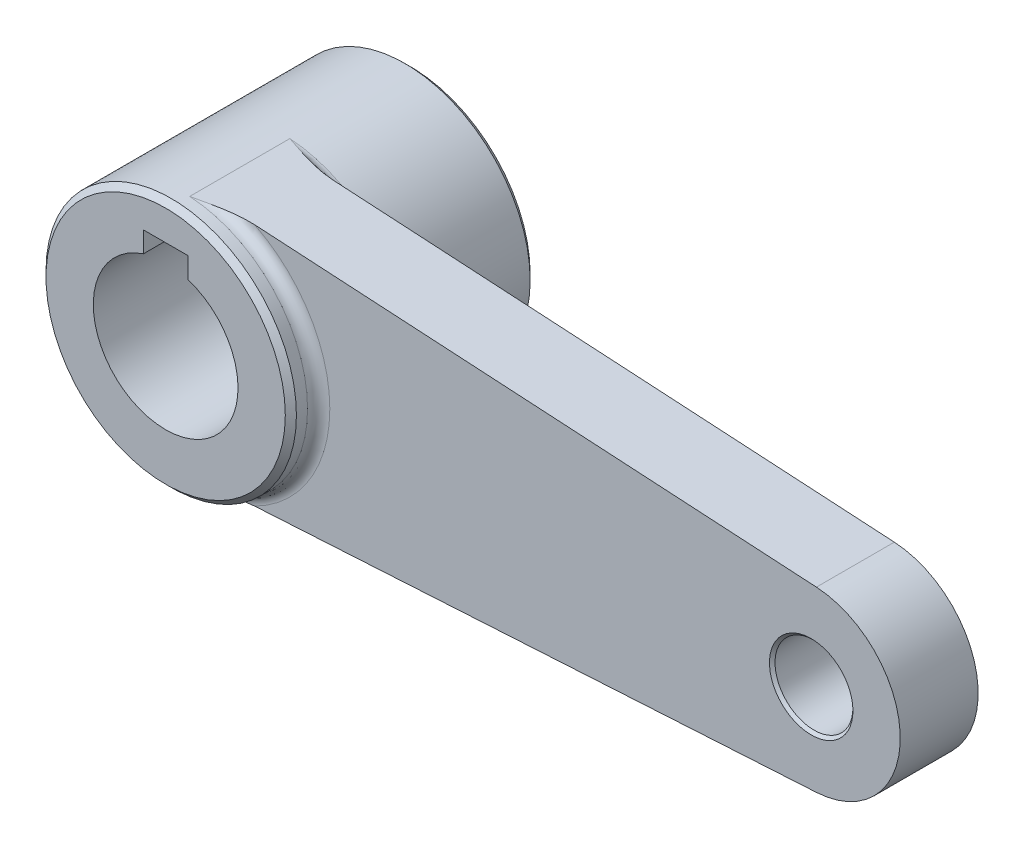
ISO-10303-21;
HEADER;
FILE_DESCRIPTION(('STEP AP214'),'2;1');
FILE_NAME('part.step','',(''),(''),'','','');
FILE_SCHEMA(('AUTOMOTIVE_DESIGN { 1 0 10303 214 1 1 1 1 }'));
ENDSEC;
DATA;
#1=APPLICATION_CONTEXT('core data for automotive mechanical design processes');
#2=APPLICATION_PROTOCOL_DEFINITION('international standard','automotive_design',2000,#1);
#3=PRODUCT_CONTEXT('',#1,'mechanical');
#4=PRODUCT('Part','Part','',(#3));
#5=PRODUCT_RELATED_PRODUCT_CATEGORY('part','',(#4));
#6=PRODUCT_DEFINITION_FORMATION('','',#4);
#7=PRODUCT_DEFINITION_CONTEXT('part definition',#1,'design');
#8=PRODUCT_DEFINITION('design','',#6,#7);
#9=PRODUCT_DEFINITION_SHAPE('','',#8);
#10=(LENGTH_UNIT() NAMED_UNIT(*) SI_UNIT(.MILLI.,.METRE.));
#11=(NAMED_UNIT(*) PLANE_ANGLE_UNIT() SI_UNIT($,.RADIAN.));
#12=(NAMED_UNIT(*) SI_UNIT($,.STERADIAN.) SOLID_ANGLE_UNIT());
#13=UNCERTAINTY_MEASURE_WITH_UNIT(LENGTH_MEASURE(1.E-05),#10,'distance_accuracy_value','');
#14=(GEOMETRIC_REPRESENTATION_CONTEXT(3) GLOBAL_UNCERTAINTY_ASSIGNED_CONTEXT((#13)) GLOBAL_UNIT_ASSIGNED_CONTEXT((#10,
#11,#12)) REPRESENTATION_CONTEXT('',''));
#15=CARTESIAN_POINT('',(0.,0.,0.));
#16=DIRECTION('',(0.,0.,1.));
#17=DIRECTION('',(1.,0.,0.));
#18=AXIS2_PLACEMENT_3D('',#15,#16,#17);
#19=CARTESIAN_POINT('',(0.,0.,7.));
#20=DIRECTION('',(0.,0.,1.));
#21=DIRECTION('',(1.,0.,0.));
#22=AXIS2_PLACEMENT_3D('',#19,#20,#21);
#23=PLANE('',#22);
#24=CARTESIAN_POINT('',(111.,0.,7.));
#25=DIRECTION('',(0.,0.,1.));
#26=DIRECTION('',(1.,0.,0.));
#27=AXIS2_PLACEMENT_3D('',#24,#25,#26);
#28=CIRCLE('',#27,7.50000000000002);
#29=CARTESIAN_POINT('',(118.5,0.,7.));
#30=VERTEX_POINT('',#29);
#31=EDGE_CURVE('E289',#30,#30,#28,.F.);
#32=ORIENTED_EDGE('',*,*,#31,.T.);
#33=EDGE_LOOP('',(#32));
#34=FACE_BOUND('',#33,.T.);
#35=DIRECTION('',(0.998283975239282,-0.0585585585585585,0.));
#36=VECTOR('',#35,1.);
#37=CARTESIAN_POINT('',(1.31756756756757,22.4613894428839,7.));
#38=LINE('',#37,#36);
#39=CARTESIAN_POINT('',(10.9962898050655,21.8936431532765,7.));
#40=VERTEX_POINT('',#39);
#41=CARTESIAN_POINT('',(111.936936936937,15.9725436038285,7.));
#42=VERTEX_POINT('',#41);
#43=EDGE_CURVE('E163',#40,#42,#38,.T.);
#44=ORIENTED_EDGE('',*,*,#43,.F.);
#45=CARTESIAN_POINT('',(0.,0.,7.));
#46=DIRECTION('',(0.,0.,1.));
#47=DIRECTION('',(1.,0.,0.));
#48=AXIS2_PLACEMENT_3D('',#45,#46,#47);
#49=CIRCLE('',#48,24.5);
#50=CARTESIAN_POINT('',(10.9962898050655,-21.8936431532765,7.));
#51=VERTEX_POINT('',#50);
#52=EDGE_CURVE('E189',#40,#51,#49,.F.);
#53=ORIENTED_EDGE('',*,*,#52,.T.);
#54=DIRECTION('',(0.998283975239282,0.0585585585585585,0.));
#55=VECTOR('',#54,1.);
#56=CARTESIAN_POINT('',(1.31756756756757,-22.4613894428838,7.));
#57=LINE('',#56,#55);
#58=CARTESIAN_POINT('',(111.936936936937,-15.9725436038285,7.));
#59=VERTEX_POINT('',#58);
#60=EDGE_CURVE('E157',#51,#59,#57,.T.);
#61=ORIENTED_EDGE('',*,*,#60,.T.);
#62=CARTESIAN_POINT('',(111.,0.,7.));
#63=DIRECTION('',(0.,0.,1.));
#64=DIRECTION('',(1.,0.,0.));
#65=AXIS2_PLACEMENT_3D('',#62,#63,#64);
#66=CIRCLE('',#65,16.);
#67=EDGE_CURVE('E159',#59,#42,#66,.T.);
#68=ORIENTED_EDGE('',*,*,#67,.T.);
#69=EDGE_LOOP('',(#44,#53,#61,#68));
#70=FACE_BOUND('',#69,.T.);
#71=ADVANCED_FACE('F43',(#34,#70),#23,.T.);
#72=CARTESIAN_POINT('',(1.31756756756757,-22.4613894428838,7.));
#73=DIRECTION('',(-0.0585585585585585,0.998283975239282,0.));
#74=DIRECTION('',(-0.998283975239282,-0.0585585585585585,0.));
#75=AXIS2_PLACEMENT_3D('',#72,#73,#74);
#76=PLANE('',#75);
#77=DIRECTION('',(0.,0.,-1.));
#78=VECTOR('',#77,1.);
#79=CARTESIAN_POINT('',(1.31756756756757,-22.4613894428838,7.));
#80=LINE('',#79,#78);
#81=CARTESIAN_POINT('',(1.31756756756757,-22.4613894428839,9.));
#82=VERTEX_POINT('',#81);
#83=CARTESIAN_POINT('',(1.31756756756757,-22.4613894428838,-9.));
#84=VERTEX_POINT('',#83);
#85=EDGE_CURVE('E165',#82,#84,#80,.T.);
#86=ORIENTED_EDGE('',*,*,#85,.T.);
#87=CARTESIAN_POINT('',(10.9962898050655,-21.8936431532765,-7.));
#88=CARTESIAN_POINT('',(10.8278260788221,-21.9035251039267,-7.00002297497926));
#89=CARTESIAN_POINT('',(10.6593905952336,-21.9134053978849,-7.00334376796952));
#90=CARTESIAN_POINT('',(10.3227835789247,-21.9331505026493,-7.01587571187002));
#91=CARTESIAN_POINT('',(10.1546119832606,-21.9430153171478,-7.02508513425725));
#92=CARTESIAN_POINT('',(9.81886810997924,-21.9627097906162,-7.04867395364367));
#93=CARTESIAN_POINT('',(9.65129532963581,-21.9725394790755,-7.06304634939414));
#94=CARTESIAN_POINT('',(9.3165993243305,-21.9921724854265,-7.09639823635647));
#95=CARTESIAN_POINT('',(9.14947613783602,-22.0019758010617,-7.11537810985719));
#96=CARTESIAN_POINT('',(8.65061536144219,-22.0312385847101,-7.17824174159337));
#97=CARTESIAN_POINT('',(8.31963232248668,-22.050653791354,-7.22818385909352));
#98=CARTESIAN_POINT('',(7.65979354367717,-22.0893594189374,-7.34101491840041));
#99=CARTESIAN_POINT('',(7.33093872920629,-22.1086497855947,-7.40390914683806));
#100=CARTESIAN_POINT('',(6.52543402970051,-22.1559000623548,-7.57109840657266));
#101=CARTESIAN_POINT('',(6.049986888175,-22.1837894204623,-7.68117145551755));
#102=CARTESIAN_POINT('',(5.1029363907507,-22.2393426632138,-7.91646706032457));
#103=CARTESIAN_POINT('',(4.63133298341508,-22.2670065508749,-8.04168941310228));
#104=CARTESIAN_POINT('',(3.21916821524031,-22.3498430336018,-8.43212254196753));
#105=CARTESIAN_POINT('',(2.28265199171335,-22.4047783440711,-8.71177325811096));
#106=CARTESIAN_POINT('',(1.33670096668163,-22.4602670926306,-8.99428573376028));
#107=CARTESIAN_POINT('',(1.32713426304262,-22.4608282679967,-8.99714287689267));
#108=CARTESIAN_POINT('',(1.31756756756757,-22.4613894428838,-9.));
#109=B_SPLINE_CURVE_WITH_KNOTS('',3,(#87,#88,#89,#90,#91,#92,#93,#94,#95,#96,#97,#98,#99,#100,
#101,#102,#103,#104,#105,#106,#107,#108),.UNSPECIFIED.,.F.,.F.,(4,2,2,2,2,2,2,2,2,2,4),(0.,
0.506187128911076,1.01222574199209,1.51758071600167,2.02297763435949,3.02849059548933,
4.03441479070745,5.500467955493,6.96650146923954,9.90288267811345,9.93288267811341),.UNSPECIFIED.);
#110=CARTESIAN_POINT('',(10.9962898050655,-21.8936431532765,-7.));
#111=VERTEX_POINT('',#110);
#112=EDGE_CURVE('E201',#84,#111,#109,.F.);
#113=ORIENTED_EDGE('',*,*,#112,.T.);
#114=DIRECTION('',(0.998283975239282,0.0585585585585585,0.));
#115=VECTOR('',#114,1.);
#116=CARTESIAN_POINT('',(1.31756756756757,-22.4613894428838,-7.));
#117=LINE('',#116,#115);
#118=CARTESIAN_POINT('',(111.936936936937,-15.9725436038285,-7.));
#119=VERTEX_POINT('',#118);
#120=EDGE_CURVE('E153',#111,#119,#117,.T.);
#121=ORIENTED_EDGE('',*,*,#120,.T.);
#122=DIRECTION('',(0.,0.,-1.));
#123=VECTOR('',#122,1.);
#124=CARTESIAN_POINT('',(111.936936936937,-15.9725436038285,7.));
#125=LINE('',#124,#123);
#126=EDGE_CURVE('E177',#59,#119,#125,.T.);
#127=ORIENTED_EDGE('',*,*,#126,.F.);
#128=ORIENTED_EDGE('',*,*,#60,.F.);
#129=CARTESIAN_POINT('',(10.9962898050655,-21.8936431532765,7.));
#130=CARTESIAN_POINT('',(10.8278260788221,-21.9035251039267,7.00002297497926));
#131=CARTESIAN_POINT('',(10.6593905952336,-21.9134053978849,7.00334376796952));
#132=CARTESIAN_POINT('',(10.3227835789247,-21.9331505026493,7.01587571187002));
#133=CARTESIAN_POINT('',(10.1546119832606,-21.9430153171478,7.02508513425725));
#134=CARTESIAN_POINT('',(9.81886810997924,-21.9627097906162,7.04867395364367));
#135=CARTESIAN_POINT('',(9.65129532963581,-21.9725394790755,7.06304634939414));
#136=CARTESIAN_POINT('',(9.3165993243305,-21.9921724854265,7.09639823635647));
#137=CARTESIAN_POINT('',(9.14947613783602,-22.0019758010617,7.11537810985719));
#138=CARTESIAN_POINT('',(8.65061536144219,-22.0312385847101,7.17824174159337));
#139=CARTESIAN_POINT('',(8.31963232248668,-22.050653791354,7.22818385909352));
#140=CARTESIAN_POINT('',(7.65979354367717,-22.0893594189374,7.34101491840041));
#141=CARTESIAN_POINT('',(7.33093872920629,-22.1086497855947,7.40390914683806));
#142=CARTESIAN_POINT('',(6.52543402970051,-22.1559000623548,7.57109840657266));
#143=CARTESIAN_POINT('',(6.049986888175,-22.1837894204623,7.68117145551755));
#144=CARTESIAN_POINT('',(5.1029363907507,-22.2393426632138,7.91646706032457));
#145=CARTESIAN_POINT('',(4.63133298341508,-22.2670065508749,8.04168941310228));
#146=CARTESIAN_POINT('',(3.21916821524031,-22.3498430336018,8.43212254196753));
#147=CARTESIAN_POINT('',(2.28265199171335,-22.4047783440711,8.71177325811096));
#148=CARTESIAN_POINT('',(1.33670096668163,-22.4602670926306,8.99428573376028));
#149=CARTESIAN_POINT('',(1.32713426304262,-22.4608282679967,8.99714287689267));
#150=CARTESIAN_POINT('',(1.31756756756757,-22.4613894428838,9.));
#151=B_SPLINE_CURVE_WITH_KNOTS('',3,(#129,#130,#131,#132,#133,#134,#135,#136,#137,#138,#139,
#140,#141,#142,#143,#144,#145,#146,#147,#148,#149,#150),.UNSPECIFIED.,.F.,.F.,(4,2,2,2,2,2,2,2,
2,2,4),(0.,0.506187128911076,1.01222574199209,1.51758071600167,2.02297763435949,
3.02849059548933,4.03441479070745,5.500467955493,6.96650146923954,9.90288267811345,
9.93288267811341),.UNSPECIFIED.);
#152=EDGE_CURVE('E229',#51,#82,#151,.T.);
#153=ORIENTED_EDGE('',*,*,#152,.T.);
#154=EDGE_LOOP('',(#86,#113,#121,#127,#128,#153));
#155=FACE_BOUND('',#154,.T.);
#156=ADVANCED_FACE('F258',(#155),#76,.F.);
#157=CARTESIAN_POINT('',(111.,0.,7.));
#158=DIRECTION('',(0.,0.,-1.));
#159=DIRECTION('',(-1.,0.,0.));
#160=AXIS2_PLACEMENT_3D('',#157,#158,#159);
#161=CYLINDRICAL_SURFACE('',#160,16.);
#162=CARTESIAN_POINT('',(111.,0.,-7.));
#163=DIRECTION('',(0.,0.,1.));
#164=DIRECTION('',(1.,0.,0.));
#165=AXIS2_PLACEMENT_3D('',#162,#163,#164);
#166=CIRCLE('',#165,16.);
#167=CARTESIAN_POINT('',(111.936936936937,15.9725436038285,-7.));
#168=VERTEX_POINT('',#167);
#169=EDGE_CURVE('E167',#119,#168,#166,.T.);
#170=ORIENTED_EDGE('',*,*,#169,.T.);
#171=DIRECTION('',(0.,0.,-1.));
#172=VECTOR('',#171,1.);
#173=CARTESIAN_POINT('',(111.936936936937,15.9725436038285,7.));
#174=LINE('',#173,#172);
#175=EDGE_CURVE('E174',#42,#168,#174,.T.);
#176=ORIENTED_EDGE('',*,*,#175,.F.);
#177=ORIENTED_EDGE('',*,*,#67,.F.);
#178=ORIENTED_EDGE('',*,*,#126,.T.);
#179=EDGE_LOOP('',(#170,#176,#177,#178));
#180=FACE_BOUND('',#179,.T.);
#181=ADVANCED_FACE('F217',(#180),#161,.T.);
#182=CARTESIAN_POINT('',(1.31756756756757,22.4613894428839,7.));
#183=DIRECTION('',(0.0585585585585585,0.998283975239282,0.));
#184=DIRECTION('',(-0.998283975239282,0.0585585585585585,0.));
#185=AXIS2_PLACEMENT_3D('',#182,#183,#184);
#186=PLANE('',#185);
#187=DIRECTION('',(0.998283975239282,-0.0585585585585585,0.));
#188=VECTOR('',#187,1.);
#189=CARTESIAN_POINT('',(1.31756756756757,22.4613894428839,-7.));
#190=LINE('',#189,#188);
#191=CARTESIAN_POINT('',(10.9962898050655,21.8936431532765,-7.));
#192=VERTEX_POINT('',#191);
#193=EDGE_CURVE('E160',#192,#168,#190,.T.);
#194=ORIENTED_EDGE('',*,*,#193,.F.);
#195=CARTESIAN_POINT('',(10.9962898050655,21.8936431532765,-7.));
#196=CARTESIAN_POINT('',(10.8278260788227,21.9035251039267,-7.00002297497926));
#197=CARTESIAN_POINT('',(10.6593905952347,21.9134053978848,-7.0033437679695));
#198=CARTESIAN_POINT('',(10.3227835789271,21.9331505026492,-7.01587571186991));
#199=CARTESIAN_POINT('',(10.1546119832635,21.9430153171477,-7.02508513425707));
#200=CARTESIAN_POINT('',(9.81886810998328,21.9627097906159,-7.04867395364335));
#201=CARTESIAN_POINT('',(9.65129532964032,21.9725394790753,-7.06304634939374));
#202=CARTESIAN_POINT('',(9.31659932433594,21.9921724854262,-7.09639823635588));
#203=CARTESIAN_POINT('',(9.14947613784192,22.0019758010614,-7.11537810985651));
#204=CARTESIAN_POINT('',(8.65061536144741,22.0312385847098,-7.17824174159259));
#205=CARTESIAN_POINT('',(8.31963232249074,22.0506537913537,-7.2281838590928));
#206=CARTESIAN_POINT('',(7.65979354367914,22.0893594189373,-7.34101491840009));
#207=CARTESIAN_POINT('',(7.33093872920733,22.1086497855946,-7.4039091468381));
#208=CARTESIAN_POINT('',(6.52543402970025,22.1559000623548,-7.57109840657233));
#209=CARTESIAN_POINT('',(6.04998688817421,22.1837894204624,-7.68117145551597));
#210=CARTESIAN_POINT('',(5.10293639075034,22.2393426632138,-7.91646706032641));
#211=CARTESIAN_POINT('',(4.63133298341568,22.2670065508748,-8.04168941310881));
#212=CARTESIAN_POINT('',(3.21916821523554,22.3498430336021,-8.43212254195542));
#213=CARTESIAN_POINT('',(2.2826519916926,22.4047783440725,-8.71177325804306));
#214=CARTESIAN_POINT('',(1.33670096668126,22.4602670926306,-8.99428573375888));
#215=CARTESIAN_POINT('',(1.32713426304243,22.4608282679967,-8.99714287689197));
#216=CARTESIAN_POINT('',(1.31756756756756,22.4613894428839,-9.));
#217=B_SPLINE_CURVE_WITH_KNOTS('',3,(#195,#196,#197,#198,#199,#200,#201,#202,#203,#204,#205,
#206,#207,#208,#209,#210,#211,#212,#213,#214,#215,#216),.UNSPECIFIED.,.F.,.F.,(4,2,2,2,2,2,2,2,
2,2,4),(0.,0.506187128909278,1.01222574198848,1.51758071599665,2.02297763435306,
3.02849059548632,4.03441479070745,5.50046795549343,6.96650146924122,9.90288267811339,
9.93288267811341),.UNSPECIFIED.);
#218=CARTESIAN_POINT('',(1.31756756756757,22.4613894428839,-9.));
#219=VERTEX_POINT('',#218);
#220=EDGE_CURVE('E192',#192,#219,#217,.T.);
#221=ORIENTED_EDGE('',*,*,#220,.T.);
#222=DIRECTION('',(0.,0.,-1.));
#223=VECTOR('',#222,1.);
#224=CARTESIAN_POINT('',(1.31756756756757,22.4613894428839,7.));
#225=LINE('',#224,#223);
#226=CARTESIAN_POINT('',(1.31756756756757,22.4613894428839,9.));
#227=VERTEX_POINT('',#226);
#228=EDGE_CURVE('E172',#227,#219,#225,.T.);
#229=ORIENTED_EDGE('',*,*,#228,.F.);
#230=CARTESIAN_POINT('',(10.9962898050655,21.8936431532765,7.));
#231=CARTESIAN_POINT('',(10.8278260788227,21.9035251039267,7.00002297497926));
#232=CARTESIAN_POINT('',(10.6593905952347,21.9134053978848,7.0033437679695));
#233=CARTESIAN_POINT('',(10.3227835789271,21.9331505026492,7.01587571186991));
#234=CARTESIAN_POINT('',(10.1546119832635,21.9430153171477,7.02508513425707));
#235=CARTESIAN_POINT('',(9.81886810998328,21.9627097906159,7.04867395364335));
#236=CARTESIAN_POINT('',(9.65129532964032,21.9725394790753,7.06304634939374));
#237=CARTESIAN_POINT('',(9.31659932433594,21.9921724854262,7.09639823635588));
#238=CARTESIAN_POINT('',(9.14947613784192,22.0019758010614,7.11537810985651));
#239=CARTESIAN_POINT('',(8.65061536144741,22.0312385847098,7.17824174159259));
#240=CARTESIAN_POINT('',(8.31963232249074,22.0506537913537,7.2281838590928));
#241=CARTESIAN_POINT('',(7.65979354367914,22.0893594189373,7.34101491840009));
#242=CARTESIAN_POINT('',(7.33093872920733,22.1086497855946,7.4039091468381));
#243=CARTESIAN_POINT('',(6.52543402970025,22.1559000623548,7.57109840657233));
#244=CARTESIAN_POINT('',(6.04998688817421,22.1837894204624,7.68117145551597));
#245=CARTESIAN_POINT('',(5.10293639075034,22.2393426632138,7.91646706032641));
#246=CARTESIAN_POINT('',(4.63133298341568,22.2670065508748,8.04168941310881));
#247=CARTESIAN_POINT('',(3.21916821523554,22.3498430336021,8.43212254195542));
#248=CARTESIAN_POINT('',(2.2826519916926,22.4047783440725,8.71177325804306));
#249=CARTESIAN_POINT('',(1.33670096668126,22.4602670926306,8.99428573375888));
#250=CARTESIAN_POINT('',(1.32713426304243,22.4608282679967,8.99714287689197));
#251=CARTESIAN_POINT('',(1.31756756756756,22.4613894428839,9.));
#252=B_SPLINE_CURVE_WITH_KNOTS('',3,(#230,#231,#232,#233,#234,#235,#236,#237,#238,#239,#240,
#241,#242,#243,#244,#245,#246,#247,#248,#249,#250,#251),.UNSPECIFIED.,.F.,.F.,(4,2,2,2,2,2,2,2,
2,2,4),(0.,0.506187128909278,1.01222574198848,1.51758071599665,2.02297763435306,
3.02849059548632,4.03441479070745,5.50046795549343,6.96650146924122,9.90288267811339,
9.93288267811341),.UNSPECIFIED.);
#253=EDGE_CURVE('E222',#227,#40,#252,.F.);
#254=ORIENTED_EDGE('',*,*,#253,.T.);
#255=ORIENTED_EDGE('',*,*,#43,.T.);
#256=ORIENTED_EDGE('',*,*,#175,.T.);
#257=EDGE_LOOP('',(#194,#221,#229,#254,#255,#256));
#258=FACE_BOUND('',#257,.T.);
#259=ADVANCED_FACE('F211',(#258),#186,.T.);
#260=CARTESIAN_POINT('',(0.,0.,7.));
#261=DIRECTION('',(0.,0.,-1.));
#262=DIRECTION('',(-1.,0.,0.));
#263=AXIS2_PLACEMENT_3D('',#260,#261,#262);
#264=CYLINDRICAL_SURFACE('',#263,22.5);
#265=CARTESIAN_POINT('',(0.,0.,-31.));
#266=DIRECTION('',(0.,0.,1.));
#267=DIRECTION('',(1.,0.,0.));
#268=AXIS2_PLACEMENT_3D('',#265,#266,#267);
#269=CIRCLE('',#268,22.5);
#270=CARTESIAN_POINT('',(22.5,0.,-31.));
#271=VERTEX_POINT('',#270);
#272=EDGE_CURVE('E51',#271,#271,#269,.T.);
#273=ORIENTED_EDGE('',*,*,#272,.T.);
#274=EDGE_LOOP('',(#273));
#275=FACE_BOUND('',#274,.T.);
#276=CARTESIAN_POINT('',(0.,0.,11.));
#277=DIRECTION('',(0.,0.,1.));
#278=DIRECTION('',(1.,0.,0.));
#279=AXIS2_PLACEMENT_3D('',#276,#277,#278);
#280=CIRCLE('',#279,22.5);
#281=CARTESIAN_POINT('',(22.5,0.,11.));
#282=VERTEX_POINT('',#281);
#283=EDGE_CURVE('E297',#282,#282,#280,.F.);
#284=ORIENTED_EDGE('',*,*,#283,.T.);
#285=EDGE_LOOP('',(#284));
#286=FACE_BOUND('',#285,.T.);
#287=ORIENTED_EDGE('',*,*,#228,.T.);
#288=CARTESIAN_POINT('',(0.,0.,-9.));
#289=DIRECTION('',(0.,0.,1.));
#290=DIRECTION('',(1.,0.,0.));
#291=AXIS2_PLACEMENT_3D('',#288,#289,#290);
#292=CIRCLE('',#291,22.5);
#293=EDGE_CURVE('E186',#219,#84,#292,.F.);
#294=ORIENTED_EDGE('',*,*,#293,.T.);
#295=ORIENTED_EDGE('',*,*,#85,.F.);
#296=CARTESIAN_POINT('',(0.,0.,9.));
#297=DIRECTION('',(0.,0.,1.));
#298=DIRECTION('',(1.,0.,0.));
#299=AXIS2_PLACEMENT_3D('',#296,#297,#298);
#300=CIRCLE('',#299,22.5);
#301=EDGE_CURVE('E183',#82,#227,#300,.T.);
#302=ORIENTED_EDGE('',*,*,#301,.T.);
#303=EDGE_LOOP('',(#287,#294,#295,#302));
#304=FACE_BOUND('',#303,.T.);
#305=ADVANCED_FACE('F216',(#275,#286,#304),#264,.T.);
#306=CARTESIAN_POINT('',(111.,0.,7.));
#307=DIRECTION('',(0.,0.,-1.));
#308=DIRECTION('',(-1.,0.,0.));
#309=AXIS2_PLACEMENT_3D('',#306,#307,#308);
#310=CYLINDRICAL_SURFACE('',#309,7.);
#311=CARTESIAN_POINT('',(111.,0.,-6.49999999999997));
#312=DIRECTION('',(0.,0.,1.));
#313=DIRECTION('',(1.,0.,0.));
#314=AXIS2_PLACEMENT_3D('',#311,#312,#313);
#315=CIRCLE('',#314,7.);
#316=CARTESIAN_POINT('',(118.,0.,-6.49999999999997));
#317=VERTEX_POINT('',#316);
#318=EDGE_CURVE('E284',#317,#317,#315,.F.);
#319=ORIENTED_EDGE('',*,*,#318,.T.);
#320=EDGE_LOOP('',(#319));
#321=FACE_BOUND('',#320,.T.);
#322=CARTESIAN_POINT('',(111.,0.,6.49999999999997));
#323=DIRECTION('',(0.,0.,1.));
#324=DIRECTION('',(1.,0.,0.));
#325=AXIS2_PLACEMENT_3D('',#322,#323,#324);
#326=CIRCLE('',#325,7.);
#327=CARTESIAN_POINT('',(118.,0.,6.49999999999997));
#328=VERTEX_POINT('',#327);
#329=EDGE_CURVE('E287',#328,#328,#326,.T.);
#330=ORIENTED_EDGE('',*,*,#329,.T.);
#331=EDGE_LOOP('',(#330));
#332=FACE_BOUND('',#331,.T.);
#333=ADVANCED_FACE('F273',(#321,#332),#310,.F.);
#334=CARTESIAN_POINT('',(0.,0.,-7.));
#335=DIRECTION('',(0.,0.,1.));
#336=DIRECTION('',(1.,0.,0.));
#337=AXIS2_PLACEMENT_3D('',#334,#335,#336);
#338=PLANE('',#337);
#339=CARTESIAN_POINT('',(111.,0.,-7.));
#340=DIRECTION('',(0.,0.,1.));
#341=DIRECTION('',(1.,0.,0.));
#342=AXIS2_PLACEMENT_3D('',#339,#340,#341);
#343=CIRCLE('',#342,7.50000000000002);
#344=CARTESIAN_POINT('',(118.5,0.,-7.));
#345=VERTEX_POINT('',#344);
#346=EDGE_CURVE('E228',#345,#345,#343,.T.);
#347=ORIENTED_EDGE('',*,*,#346,.T.);
#348=EDGE_LOOP('',(#347));
#349=FACE_BOUND('',#348,.T.);
#350=ORIENTED_EDGE('',*,*,#120,.F.);
#351=CARTESIAN_POINT('',(0.,0.,-7.));
#352=DIRECTION('',(0.,0.,1.));
#353=DIRECTION('',(1.,0.,0.));
#354=AXIS2_PLACEMENT_3D('',#351,#352,#353);
#355=CIRCLE('',#354,24.5);
#356=EDGE_CURVE('E180',#111,#192,#355,.T.);
#357=ORIENTED_EDGE('',*,*,#356,.T.);
#358=ORIENTED_EDGE('',*,*,#193,.T.);
#359=ORIENTED_EDGE('',*,*,#169,.F.);
#360=EDGE_LOOP('',(#350,#357,#358,#359));
#361=FACE_BOUND('',#360,.T.);
#362=ADVANCED_FACE('F271',(#349,#361),#338,.F.);
#363=CARTESIAN_POINT('',(0.,0.,12.));
#364=DIRECTION('',(0.,0.,1.));
#365=DIRECTION('',(1.,0.,0.));
#366=AXIS2_PLACEMENT_3D('',#363,#364,#365);
#367=PLANE('',#366);
#368=CARTESIAN_POINT('',(0.,0.,12.));
#369=DIRECTION('',(0.,0.,1.));
#370=DIRECTION('',(1.,0.,0.));
#371=AXIS2_PLACEMENT_3D('',#368,#369,#370);
#372=CIRCLE('',#371,13.);
#373=CARTESIAN_POINT('',(-4.00000000000001,12.369316876853,12.));
#374=VERTEX_POINT('',#373);
#375=CARTESIAN_POINT('',(4.,12.369316876853,12.));
#376=VERTEX_POINT('',#375);
#377=EDGE_CURVE('E58',#374,#376,#372,.T.);
#378=ORIENTED_EDGE('',*,*,#377,.F.);
#379=DIRECTION('',(0.,1.,0.));
#380=VECTOR('',#379,1.);
#381=CARTESIAN_POINT('',(-4.00000000000001,0.,12.));
#382=LINE('',#381,#380);
#383=CARTESIAN_POINT('',(-4.00000000000001,16.1,12.));
#384=VERTEX_POINT('',#383);
#385=EDGE_CURVE('E138',#374,#384,#382,.T.);
#386=ORIENTED_EDGE('',*,*,#385,.T.);
#387=DIRECTION('',(-1.,0.,0.));
#388=VECTOR('',#387,1.);
#389=CARTESIAN_POINT('',(0.,16.1,12.));
#390=LINE('',#389,#388);
#391=CARTESIAN_POINT('',(3.99999999999999,16.1,12.));
#392=VERTEX_POINT('',#391);
#393=EDGE_CURVE('E141',#392,#384,#390,.T.);
#394=ORIENTED_EDGE('',*,*,#393,.F.);
#395=DIRECTION('',(0.,1.,0.));
#396=VECTOR('',#395,1.);
#397=CARTESIAN_POINT('',(4.00000000000001,0.,12.));
#398=LINE('',#397,#396);
#399=EDGE_CURVE('E147',#376,#392,#398,.T.);
#400=ORIENTED_EDGE('',*,*,#399,.F.);
#401=EDGE_LOOP('',(#378,#386,#394,#400));
#402=FACE_BOUND('',#401,.T.);
#403=CARTESIAN_POINT('',(0.,0.,12.));
#404=DIRECTION('',(0.,0.,1.));
#405=DIRECTION('',(1.,0.,0.));
#406=AXIS2_PLACEMENT_3D('',#403,#404,#405);
#407=CIRCLE('',#406,21.5);
#408=CARTESIAN_POINT('',(21.5,0.,12.));
#409=VERTEX_POINT('',#408);
#410=EDGE_CURVE('E12',#409,#409,#407,.T.);
#411=ORIENTED_EDGE('',*,*,#410,.T.);
#412=EDGE_LOOP('',(#411));
#413=FACE_BOUND('',#412,.T.);
#414=ADVANCED_FACE('F269',(#402,#413),#367,.T.);
#415=CARTESIAN_POINT('',(0.,0.,-32.));
#416=DIRECTION('',(0.,0.,1.));
#417=DIRECTION('',(1.,0.,0.));
#418=AXIS2_PLACEMENT_3D('',#415,#416,#417);
#419=PLANE('',#418);
#420=DIRECTION('',(0.,1.,0.));
#421=VECTOR('',#420,1.);
#422=CARTESIAN_POINT('',(-4.00000000000001,0.,-32.));
#423=LINE('',#422,#421);
#424=CARTESIAN_POINT('',(-4.00000000000001,12.369316876853,-32.));
#425=VERTEX_POINT('',#424);
#426=CARTESIAN_POINT('',(-4.00000000000001,16.1,-32.));
#427=VERTEX_POINT('',#426);
#428=EDGE_CURVE('E129',#425,#427,#423,.T.);
#429=ORIENTED_EDGE('',*,*,#428,.F.);
#430=CARTESIAN_POINT('',(0.,0.,-32.));
#431=DIRECTION('',(0.,0.,1.));
#432=DIRECTION('',(1.,0.,0.));
#433=AXIS2_PLACEMENT_3D('',#430,#431,#432);
#434=CIRCLE('',#433,13.);
#435=CARTESIAN_POINT('',(4.,12.369316876853,-32.));
#436=VERTEX_POINT('',#435);
#437=EDGE_CURVE('E123',#425,#436,#434,.T.);
#438=ORIENTED_EDGE('',*,*,#437,.T.);
#439=DIRECTION('',(0.,1.,0.));
#440=VECTOR('',#439,1.);
#441=CARTESIAN_POINT('',(4.00000000000001,0.,-32.));
#442=LINE('',#441,#440);
#443=CARTESIAN_POINT('',(3.99999999999999,16.1,-32.));
#444=VERTEX_POINT('',#443);
#445=EDGE_CURVE('E132',#436,#444,#442,.T.);
#446=ORIENTED_EDGE('',*,*,#445,.T.);
#447=DIRECTION('',(-1.,0.,0.));
#448=VECTOR('',#447,1.);
#449=CARTESIAN_POINT('',(0.,16.1,-32.));
#450=LINE('',#449,#448);
#451=EDGE_CURVE('E66',#444,#427,#450,.T.);
#452=ORIENTED_EDGE('',*,*,#451,.T.);
#453=EDGE_LOOP('',(#429,#438,#446,#452));
#454=FACE_BOUND('',#453,.T.);
#455=CARTESIAN_POINT('',(0.,0.,-32.));
#456=DIRECTION('',(0.,0.,1.));
#457=DIRECTION('',(1.,0.,0.));
#458=AXIS2_PLACEMENT_3D('',#455,#456,#457);
#459=CIRCLE('',#458,21.5);
#460=CARTESIAN_POINT('',(21.5,0.,-32.));
#461=VERTEX_POINT('',#460);
#462=EDGE_CURVE('E294',#461,#461,#459,.F.);
#463=ORIENTED_EDGE('',*,*,#462,.T.);
#464=EDGE_LOOP('',(#463));
#465=FACE_BOUND('',#464,.T.);
#466=ADVANCED_FACE('F136',(#454,#465),#419,.F.);
#467=CARTESIAN_POINT('',(0.,0.,-9.));
#468=DIRECTION('',(0.,0.,1.));
#469=DIRECTION('',(1.,0.,0.));
#470=AXIS2_PLACEMENT_3D('',#467,#468,#469);
#471=TOROIDAL_SURFACE('',#470,24.5,2.);
#472=ORIENTED_EDGE('',*,*,#112,.F.);
#473=ORIENTED_EDGE('',*,*,#293,.F.);
#474=ORIENTED_EDGE('',*,*,#220,.F.);
#475=ORIENTED_EDGE('',*,*,#356,.F.);
#476=EDGE_LOOP('',(#472,#473,#474,#475));
#477=FACE_BOUND('',#476,.T.);
#478=ADVANCED_FACE('F208',(#477),#471,.F.);
#479=CARTESIAN_POINT('',(0.,0.,9.));
#480=DIRECTION('',(0.,0.,1.));
#481=DIRECTION('',(1.,0.,0.));
#482=AXIS2_PLACEMENT_3D('',#479,#480,#481);
#483=TOROIDAL_SURFACE('',#482,24.5,2.);
#484=ORIENTED_EDGE('',*,*,#253,.F.);
#485=ORIENTED_EDGE('',*,*,#301,.F.);
#486=ORIENTED_EDGE('',*,*,#152,.F.);
#487=ORIENTED_EDGE('',*,*,#52,.F.);
#488=EDGE_LOOP('',(#484,#485,#486,#487));
#489=FACE_BOUND('',#488,.T.);
#490=ADVANCED_FACE('F235',(#489),#483,.F.);
#491=CARTESIAN_POINT('',(111.,0.,-7.));
#492=DIRECTION('',(0.,0.,-1.));
#493=DIRECTION('',(-1.,0.,0.));
#494=AXIS2_PLACEMENT_3D('',#491,#492,#493);
#495=CONICAL_SURFACE('',#494,7.50000000000002,0.785398163397439);
#496=ORIENTED_EDGE('',*,*,#318,.F.);
#497=EDGE_LOOP('',(#496));
#498=FACE_BOUND('',#497,.T.);
#499=ORIENTED_EDGE('',*,*,#346,.F.);
#500=EDGE_LOOP('',(#499));
#501=FACE_BOUND('',#500,.T.);
#502=ADVANCED_FACE('F239',(#498,#501),#495,.F.);
#503=CARTESIAN_POINT('',(111.,0.,6.49999999999997));
#504=DIRECTION('',(0.,0.,1.));
#505=DIRECTION('',(1.,0.,0.));
#506=AXIS2_PLACEMENT_3D('',#503,#504,#505);
#507=CONICAL_SURFACE('',#506,7.,0.785398163397438);
#508=ORIENTED_EDGE('',*,*,#31,.F.);
#509=EDGE_LOOP('',(#508));
#510=FACE_BOUND('',#509,.T.);
#511=ORIENTED_EDGE('',*,*,#329,.F.);
#512=EDGE_LOOP('',(#511));
#513=FACE_BOUND('',#512,.T.);
#514=ADVANCED_FACE('F244',(#510,#513),#507,.F.);
#515=CARTESIAN_POINT('',(0.,0.,-32.));
#516=DIRECTION('',(0.,0.,1.));
#517=DIRECTION('',(1.,0.,0.));
#518=AXIS2_PLACEMENT_3D('',#515,#516,#517);
#519=CONICAL_SURFACE('',#518,21.5,0.78539816339745);
#520=ORIENTED_EDGE('',*,*,#272,.F.);
#521=EDGE_LOOP('',(#520));
#522=FACE_BOUND('',#521,.T.);
#523=ORIENTED_EDGE('',*,*,#462,.F.);
#524=EDGE_LOOP('',(#523));
#525=FACE_BOUND('',#524,.T.);
#526=ADVANCED_FACE('F247',(#522,#525),#519,.T.);
#527=CARTESIAN_POINT('',(0.,0.,12.));
#528=DIRECTION('',(0.,0.,-1.));
#529=DIRECTION('',(-1.,0.,0.));
#530=AXIS2_PLACEMENT_3D('',#527,#528,#529);
#531=CONICAL_SURFACE('',#530,21.5,0.78539816339745);
#532=ORIENTED_EDGE('',*,*,#283,.F.);
#533=EDGE_LOOP('',(#532));
#534=FACE_BOUND('',#533,.T.);
#535=ORIENTED_EDGE('',*,*,#410,.F.);
#536=EDGE_LOOP('',(#535));
#537=FACE_BOUND('',#536,.T.);
#538=ADVANCED_FACE('F45',(#534,#537),#531,.T.);
#539=CARTESIAN_POINT('',(0.,0.,-32.));
#540=DIRECTION('',(0.,0.,1.));
#541=DIRECTION('',(1.,0.,0.));
#542=AXIS2_PLACEMENT_3D('',#539,#540,#541);
#543=CYLINDRICAL_SURFACE('',#542,13.);
#544=ORIENTED_EDGE('',*,*,#377,.T.);
#545=DIRECTION('',(0.,0.,1.));
#546=VECTOR('',#545,1.);
#547=CARTESIAN_POINT('',(4.,12.369316876853,-32.));
#548=LINE('',#547,#546);
#549=EDGE_CURVE('E119',#436,#376,#548,.T.);
#550=ORIENTED_EDGE('',*,*,#549,.F.);
#551=ORIENTED_EDGE('',*,*,#437,.F.);
#552=DIRECTION('',(0.,0.,1.));
#553=VECTOR('',#552,1.);
#554=CARTESIAN_POINT('',(-4.00000000000001,12.369316876853,-32.));
#555=LINE('',#554,#553);
#556=EDGE_CURVE('E151',#425,#374,#555,.T.);
#557=ORIENTED_EDGE('',*,*,#556,.T.);
#558=EDGE_LOOP('',(#544,#550,#551,#557));
#559=FACE_BOUND('',#558,.T.);
#560=ADVANCED_FACE('F121',(#559),#543,.F.);
#561=CARTESIAN_POINT('',(-4.00000000000001,0.,-32.));
#562=DIRECTION('',(1.,0.,0.));
#563=DIRECTION('',(0.,0.,-1.));
#564=AXIS2_PLACEMENT_3D('',#561,#562,#563);
#565=PLANE('',#564);
#566=ORIENTED_EDGE('',*,*,#385,.F.);
#567=ORIENTED_EDGE('',*,*,#556,.F.);
#568=ORIENTED_EDGE('',*,*,#428,.T.);
#569=DIRECTION('',(0.,0.,1.));
#570=VECTOR('',#569,1.);
#571=CARTESIAN_POINT('',(-4.00000000000001,16.1,-32.));
#572=LINE('',#571,#570);
#573=EDGE_CURVE('E154',#427,#384,#572,.T.);
#574=ORIENTED_EDGE('',*,*,#573,.T.);
#575=EDGE_LOOP('',(#566,#567,#568,#574));
#576=FACE_BOUND('',#575,.T.);
#577=ADVANCED_FACE('F371',(#576),#565,.T.);
#578=CARTESIAN_POINT('',(0.,16.1,-32.));
#579=DIRECTION('',(0.,1.,0.));
#580=DIRECTION('',(-1.,0.,0.));
#581=AXIS2_PLACEMENT_3D('',#578,#579,#580);
#582=PLANE('',#581);
#583=ORIENTED_EDGE('',*,*,#393,.T.);
#584=ORIENTED_EDGE('',*,*,#573,.F.);
#585=ORIENTED_EDGE('',*,*,#451,.F.);
#586=DIRECTION('',(0.,0.,1.));
#587=VECTOR('',#586,1.);
#588=CARTESIAN_POINT('',(3.99999999999999,16.1,-32.));
#589=LINE('',#588,#587);
#590=EDGE_CURVE('E128',#444,#392,#589,.T.);
#591=ORIENTED_EDGE('',*,*,#590,.T.);
#592=EDGE_LOOP('',(#583,#584,#585,#591));
#593=FACE_BOUND('',#592,.T.);
#594=ADVANCED_FACE('F381',(#593),#582,.F.);
#595=CARTESIAN_POINT('',(4.00000000000001,0.,-32.));
#596=DIRECTION('',(1.,0.,0.));
#597=DIRECTION('',(0.,1.,0.));
#598=AXIS2_PLACEMENT_3D('',#595,#596,#597);
#599=PLANE('',#598);
#600=ORIENTED_EDGE('',*,*,#399,.T.);
#601=ORIENTED_EDGE('',*,*,#590,.F.);
#602=ORIENTED_EDGE('',*,*,#445,.F.);
#603=ORIENTED_EDGE('',*,*,#549,.T.);
#604=EDGE_LOOP('',(#600,#601,#602,#603));
#605=FACE_BOUND('',#604,.T.);
#606=ADVANCED_FACE('F133',(#605),#599,.F.);
#607=CLOSED_SHELL('',(#71,#156,#181,#259,#305,#333,#362,#414,#466,#478,#490,#502,#514,#526,#538,
#560,#577,#594,#606));
#608=MANIFOLD_SOLID_BREP('B2',#607);
#609=ADVANCED_BREP_SHAPE_REPRESENTATION('',(#18,#608),#14);
#610=SHAPE_DEFINITION_REPRESENTATION(#9,#609);
ENDSEC;
END-ISO-10303-21;
